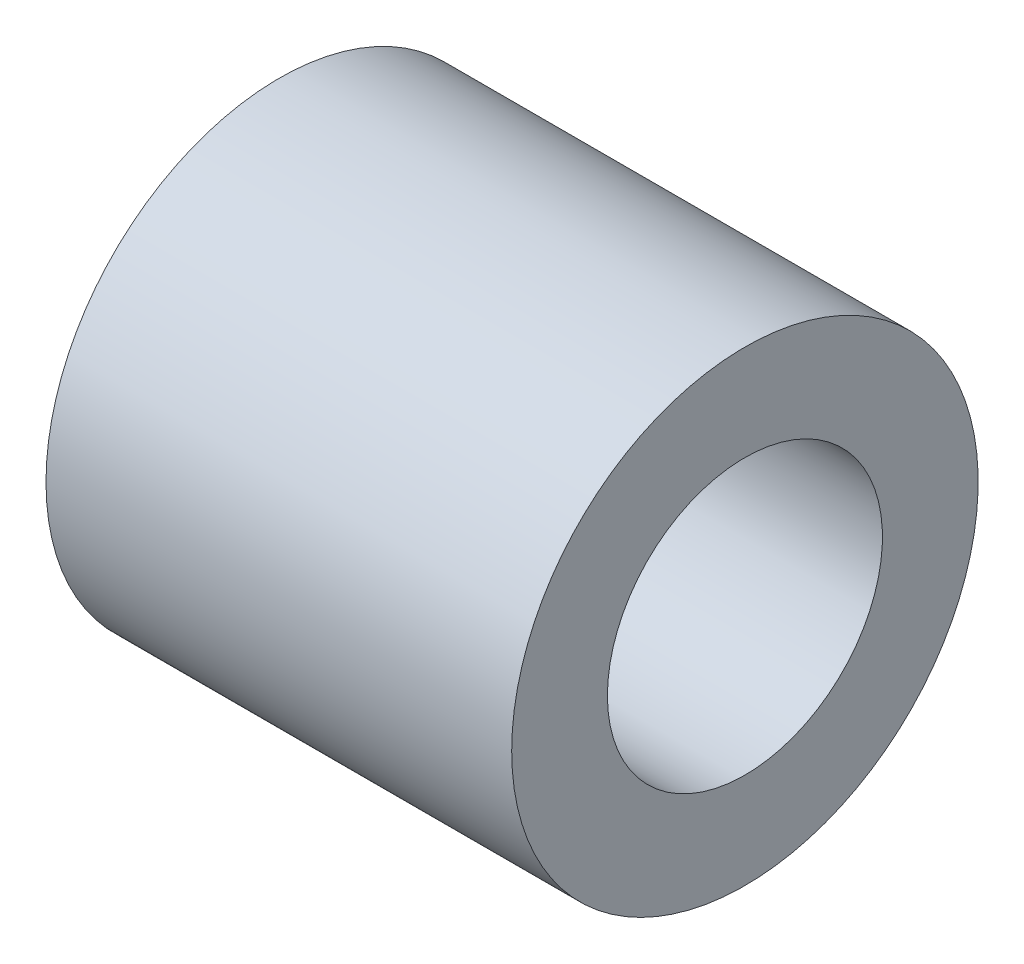
ISO-10303-21;
HEADER;
FILE_DESCRIPTION(('STEP AP214'),'2;1');
FILE_NAME('part.step','',(''),(''),'','','');
FILE_SCHEMA(('AUTOMOTIVE_DESIGN { 1 0 10303 214 1 1 1 1 }'));
ENDSEC;
DATA;
#1=APPLICATION_CONTEXT('core data for automotive mechanical design processes');
#2=APPLICATION_PROTOCOL_DEFINITION('international standard','automotive_design',2000,#1);
#3=PRODUCT_CONTEXT('',#1,'mechanical');
#4=PRODUCT('Part','Part','',(#3));
#5=PRODUCT_RELATED_PRODUCT_CATEGORY('part','',(#4));
#6=PRODUCT_DEFINITION_FORMATION('','',#4);
#7=PRODUCT_DEFINITION_CONTEXT('part definition',#1,'design');
#8=PRODUCT_DEFINITION('design','',#6,#7);
#9=PRODUCT_DEFINITION_SHAPE('','',#8);
#10=(LENGTH_UNIT() NAMED_UNIT(*) SI_UNIT(.MILLI.,.METRE.));
#11=(NAMED_UNIT(*) PLANE_ANGLE_UNIT() SI_UNIT($,.RADIAN.));
#12=(NAMED_UNIT(*) SI_UNIT($,.STERADIAN.) SOLID_ANGLE_UNIT());
#13=UNCERTAINTY_MEASURE_WITH_UNIT(LENGTH_MEASURE(1.E-05),#10,'distance_accuracy_value','');
#14=(GEOMETRIC_REPRESENTATION_CONTEXT(3) GLOBAL_UNCERTAINTY_ASSIGNED_CONTEXT((#13)) GLOBAL_UNIT_ASSIGNED_CONTEXT((#10,
#11,#12)) REPRESENTATION_CONTEXT('',''));
#15=CARTESIAN_POINT('',(0.,0.,0.));
#16=DIRECTION('',(0.,0.,1.));
#17=DIRECTION('',(1.,0.,0.));
#18=AXIS2_PLACEMENT_3D('',#15,#16,#17);
#19=CARTESIAN_POINT('',(0.,0.,0.));
#20=DIRECTION('',(-1.,0.,0.));
#21=DIRECTION('',(0.,0.,1.));
#22=AXIS2_PLACEMENT_3D('',#19,#20,#21);
#23=CYLINDRICAL_SURFACE('',#22,6.29876529202109);
#24=CARTESIAN_POINT('',(0.,0.,0.));
#25=DIRECTION('',(-1.,0.,0.));
#26=DIRECTION('',(0.,0.,1.));
#27=AXIS2_PLACEMENT_3D('',#24,#25,#26);
#28=CIRCLE('',#27,6.29876529202109);
#29=CARTESIAN_POINT('',(0.,0.,6.29876529202109));
#30=VERTEX_POINT('',#29);
#31=EDGE_CURVE('E27',#30,#30,#28,.F.);
#32=ORIENTED_EDGE('',*,*,#31,.T.);
#33=EDGE_LOOP('',(#32));
#34=FACE_BOUND('',#33,.T.);
#35=CARTESIAN_POINT('',(-21.3291455305787,0.,0.));
#36=DIRECTION('',(-1.,0.,0.));
#37=DIRECTION('',(0.,0.,1.));
#38=AXIS2_PLACEMENT_3D('',#35,#36,#37);
#39=CIRCLE('',#38,6.29876529202109);
#40=CARTESIAN_POINT('',(-21.3291455305787,0.,6.29876529202109));
#41=VERTEX_POINT('',#40);
#42=EDGE_CURVE('E18',#41,#41,#39,.F.);
#43=ORIENTED_EDGE('',*,*,#42,.F.);
#44=EDGE_LOOP('',(#43));
#45=FACE_BOUND('',#44,.T.);
#46=ADVANCED_FACE('F15',(#34,#45),#23,.F.);
#47=CARTESIAN_POINT('',(-21.3291455305787,0.,0.));
#48=DIRECTION('',(-1.,0.,0.));
#49=DIRECTION('',(0.,0.,1.));
#50=AXIS2_PLACEMENT_3D('',#47,#48,#49);
#51=PLANE('',#50);
#52=CARTESIAN_POINT('',(-21.3291455305787,0.,0.));
#53=DIRECTION('',(-1.,0.,0.));
#54=DIRECTION('',(0.,0.,1.));
#55=AXIS2_PLACEMENT_3D('',#52,#53,#54);
#56=CIRCLE('',#55,10.6826885764876);
#57=CARTESIAN_POINT('',(-21.3291455305787,0.,10.6826885764876));
#58=VERTEX_POINT('',#57);
#59=EDGE_CURVE('E22',#58,#58,#56,.F.);
#60=ORIENTED_EDGE('',*,*,#59,.F.);
#61=EDGE_LOOP('',(#60));
#62=FACE_BOUND('',#61,.T.);
#63=ORIENTED_EDGE('',*,*,#42,.T.);
#64=EDGE_LOOP('',(#63));
#65=FACE_BOUND('',#64,.T.);
#66=ADVANCED_FACE('F35',(#62,#65),#51,.T.);
#67=CARTESIAN_POINT('',(0.,0.,0.));
#68=DIRECTION('',(-1.,0.,0.));
#69=DIRECTION('',(0.,0.,1.));
#70=AXIS2_PLACEMENT_3D('',#67,#68,#69);
#71=PLANE('',#70);
#72=CARTESIAN_POINT('',(0.,0.,0.));
#73=DIRECTION('',(-1.,0.,0.));
#74=DIRECTION('',(0.,0.,1.));
#75=AXIS2_PLACEMENT_3D('',#72,#73,#74);
#76=CIRCLE('',#75,10.6826885764876);
#77=CARTESIAN_POINT('',(0.,0.,10.6826885764876));
#78=VERTEX_POINT('',#77);
#79=EDGE_CURVE('E10',#78,#78,#76,.T.);
#80=ORIENTED_EDGE('',*,*,#79,.F.);
#81=EDGE_LOOP('',(#80));
#82=FACE_BOUND('',#81,.T.);
#83=ORIENTED_EDGE('',*,*,#31,.F.);
#84=EDGE_LOOP('',(#83));
#85=FACE_BOUND('',#84,.T.);
#86=ADVANCED_FACE('F42',(#82,#85),#71,.F.);
#87=CARTESIAN_POINT('',(0.,0.,0.));
#88=DIRECTION('',(-1.,0.,0.));
#89=DIRECTION('',(0.,0.,1.));
#90=AXIS2_PLACEMENT_3D('',#87,#88,#89);
#91=CYLINDRICAL_SURFACE('',#90,10.6826885764876);
#92=ORIENTED_EDGE('',*,*,#59,.T.);
#93=EDGE_LOOP('',(#92));
#94=FACE_BOUND('',#93,.T.);
#95=ORIENTED_EDGE('',*,*,#79,.T.);
#96=EDGE_LOOP('',(#95));
#97=FACE_BOUND('',#96,.T.);
#98=ADVANCED_FACE('F44',(#94,#97),#91,.T.);
#99=CLOSED_SHELL('',(#46,#66,#86,#98));
#100=MANIFOLD_SOLID_BREP('B1',#99);
#101=ADVANCED_BREP_SHAPE_REPRESENTATION('',(#18,#100),#14);
#102=SHAPE_DEFINITION_REPRESENTATION(#9,#101);
ENDSEC;
END-ISO-10303-21;
